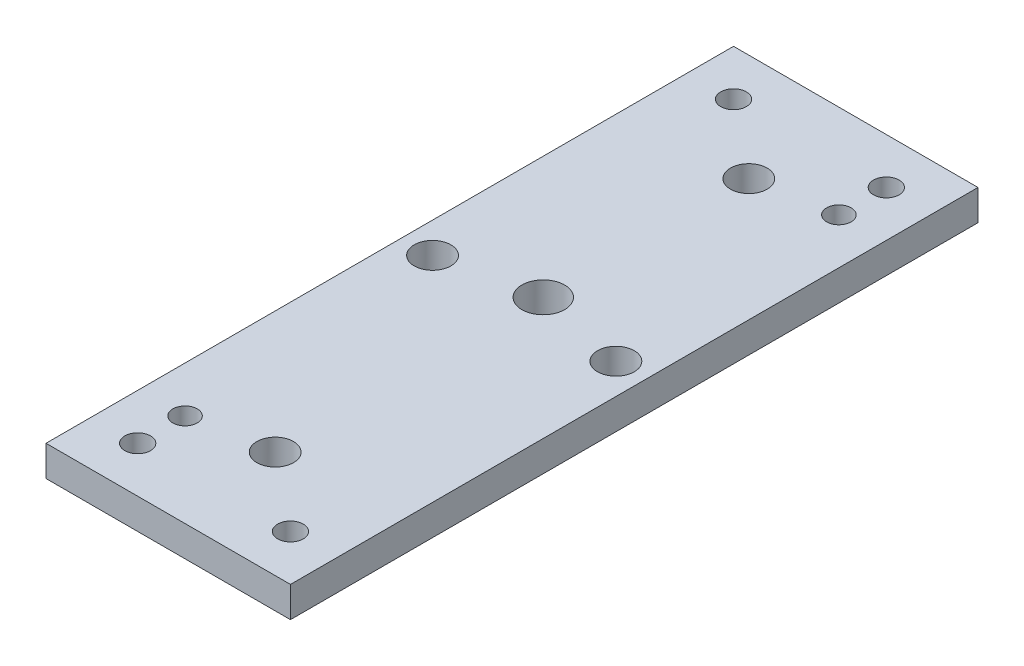
ISO-10303-21;
HEADER;
FILE_DESCRIPTION(('STEP AP214'),'2;1');
FILE_NAME('part.step','',(''),(''),'','','');
FILE_SCHEMA(('AUTOMOTIVE_DESIGN { 1 0 10303 214 1 1 1 1 }'));
ENDSEC;
DATA;
#1=APPLICATION_CONTEXT('core data for automotive mechanical design processes');
#2=APPLICATION_PROTOCOL_DEFINITION('international standard','automotive_design',2000,#1);
#3=PRODUCT_CONTEXT('',#1,'mechanical');
#4=PRODUCT('Part','Part','',(#3));
#5=PRODUCT_RELATED_PRODUCT_CATEGORY('part','',(#4));
#6=PRODUCT_DEFINITION_FORMATION('','',#4);
#7=PRODUCT_DEFINITION_CONTEXT('part definition',#1,'design');
#8=PRODUCT_DEFINITION('design','',#6,#7);
#9=PRODUCT_DEFINITION_SHAPE('','',#8);
#10=(LENGTH_UNIT() NAMED_UNIT(*) SI_UNIT(.MILLI.,.METRE.));
#11=(NAMED_UNIT(*) PLANE_ANGLE_UNIT() SI_UNIT($,.RADIAN.));
#12=(NAMED_UNIT(*) SI_UNIT($,.STERADIAN.) SOLID_ANGLE_UNIT());
#13=UNCERTAINTY_MEASURE_WITH_UNIT(LENGTH_MEASURE(1.E-05),#10,'distance_accuracy_value','');
#14=(GEOMETRIC_REPRESENTATION_CONTEXT(3) GLOBAL_UNCERTAINTY_ASSIGNED_CONTEXT((#13)) GLOBAL_UNIT_ASSIGNED_CONTEXT((#10,
#11,#12)) REPRESENTATION_CONTEXT('',''));
#15=CARTESIAN_POINT('',(0.,0.,0.));
#16=DIRECTION('',(0.,0.,1.));
#17=DIRECTION('',(1.,0.,0.));
#18=AXIS2_PLACEMENT_3D('',#15,#16,#17);
#19=CARTESIAN_POINT('',(40.,-10.,112.5));
#20=DIRECTION('',(1.,0.,0.));
#21=DIRECTION('',(0.,0.,-1.));
#22=AXIS2_PLACEMENT_3D('',#19,#20,#21);
#23=PLANE('',#22);
#24=DIRECTION('',(0.,0.,-1.));
#25=VECTOR('',#24,1.);
#26=CARTESIAN_POINT('',(40.,0.,112.5));
#27=LINE('',#26,#25);
#28=CARTESIAN_POINT('',(40.,0.,112.5));
#29=VERTEX_POINT('',#28);
#30=CARTESIAN_POINT('',(40.,0.,-112.5));
#31=VERTEX_POINT('',#30);
#32=EDGE_CURVE('E106',#29,#31,#27,.T.);
#33=ORIENTED_EDGE('',*,*,#32,.F.);
#34=DIRECTION('',(0.,1.,0.));
#35=VECTOR('',#34,1.);
#36=CARTESIAN_POINT('',(40.,-10.,112.5));
#37=LINE('',#36,#35);
#38=CARTESIAN_POINT('',(40.,-10.,112.5));
#39=VERTEX_POINT('',#38);
#40=EDGE_CURVE('E11',#39,#29,#37,.T.);
#41=ORIENTED_EDGE('',*,*,#40,.F.);
#42=DIRECTION('',(0.,0.,-1.));
#43=VECTOR('',#42,1.);
#44=CARTESIAN_POINT('',(40.,-10.,112.5));
#45=LINE('',#44,#43);
#46=CARTESIAN_POINT('',(40.,-10.,-112.5));
#47=VERTEX_POINT('',#46);
#48=EDGE_CURVE('E99',#39,#47,#45,.T.);
#49=ORIENTED_EDGE('',*,*,#48,.T.);
#50=DIRECTION('',(0.,1.,0.));
#51=VECTOR('',#50,1.);
#52=CARTESIAN_POINT('',(40.,-10.,-112.5));
#53=LINE('',#52,#51);
#54=EDGE_CURVE('E44',#47,#31,#53,.T.);
#55=ORIENTED_EDGE('',*,*,#54,.T.);
#56=EDGE_LOOP('',(#33,#41,#49,#55));
#57=FACE_BOUND('',#56,.T.);
#58=ADVANCED_FACE('F41',(#57),#23,.T.);
#59=CARTESIAN_POINT('',(-40.,-10.,112.5));
#60=DIRECTION('',(0.,0.,1.));
#61=DIRECTION('',(1.,0.,0.));
#62=AXIS2_PLACEMENT_3D('',#59,#60,#61);
#63=PLANE('',#62);
#64=DIRECTION('',(1.,0.,0.));
#65=VECTOR('',#64,1.);
#66=CARTESIAN_POINT('',(-40.,0.,112.5));
#67=LINE('',#66,#65);
#68=CARTESIAN_POINT('',(-40.,0.,112.5));
#69=VERTEX_POINT('',#68);
#70=EDGE_CURVE('E101',#69,#29,#67,.T.);
#71=ORIENTED_EDGE('',*,*,#70,.F.);
#72=DIRECTION('',(0.,1.,0.));
#73=VECTOR('',#72,1.);
#74=CARTESIAN_POINT('',(-40.,-10.,112.5));
#75=LINE('',#74,#73);
#76=CARTESIAN_POINT('',(-40.,-10.,112.5));
#77=VERTEX_POINT('',#76);
#78=EDGE_CURVE('E50',#77,#69,#75,.T.);
#79=ORIENTED_EDGE('',*,*,#78,.F.);
#80=DIRECTION('',(1.,0.,0.));
#81=VECTOR('',#80,1.);
#82=CARTESIAN_POINT('',(-40.,-10.,112.5));
#83=LINE('',#82,#81);
#84=EDGE_CURVE('E96',#77,#39,#83,.T.);
#85=ORIENTED_EDGE('',*,*,#84,.T.);
#86=ORIENTED_EDGE('',*,*,#40,.T.);
#87=EDGE_LOOP('',(#71,#79,#85,#86));
#88=FACE_BOUND('',#87,.T.);
#89=ADVANCED_FACE('F117',(#88),#63,.T.);
#90=CARTESIAN_POINT('',(-40.,-10.,112.5));
#91=DIRECTION('',(-1.,0.,0.));
#92=DIRECTION('',(0.,0.,1.));
#93=AXIS2_PLACEMENT_3D('',#90,#91,#92);
#94=PLANE('',#93);
#95=DIRECTION('',(0.,0.,1.));
#96=VECTOR('',#95,1.);
#97=CARTESIAN_POINT('',(-40.,0.,112.5));
#98=LINE('',#97,#96);
#99=CARTESIAN_POINT('',(-40.,0.,-112.5));
#100=VERTEX_POINT('',#99);
#101=EDGE_CURVE('E91',#100,#69,#98,.T.);
#102=ORIENTED_EDGE('',*,*,#101,.F.);
#103=DIRECTION('',(0.,1.,0.));
#104=VECTOR('',#103,1.);
#105=CARTESIAN_POINT('',(-40.,-10.,-112.5));
#106=LINE('',#105,#104);
#107=CARTESIAN_POINT('',(-40.,-10.,-112.5));
#108=VERTEX_POINT('',#107);
#109=EDGE_CURVE('E86',#108,#100,#106,.T.);
#110=ORIENTED_EDGE('',*,*,#109,.F.);
#111=DIRECTION('',(0.,0.,1.));
#112=VECTOR('',#111,1.);
#113=CARTESIAN_POINT('',(-40.,-10.,112.5));
#114=LINE('',#113,#112);
#115=EDGE_CURVE('E89',#108,#77,#114,.T.);
#116=ORIENTED_EDGE('',*,*,#115,.T.);
#117=ORIENTED_EDGE('',*,*,#78,.T.);
#118=EDGE_LOOP('',(#102,#110,#116,#117));
#119=FACE_BOUND('',#118,.T.);
#120=ADVANCED_FACE('F88',(#119),#94,.T.);
#121=CARTESIAN_POINT('',(-40.,-10.,-112.5));
#122=DIRECTION('',(0.,0.,-1.));
#123=DIRECTION('',(-1.,0.,0.));
#124=AXIS2_PLACEMENT_3D('',#121,#122,#123);
#125=PLANE('',#124);
#126=DIRECTION('',(-1.,0.,0.));
#127=VECTOR('',#126,1.);
#128=CARTESIAN_POINT('',(-40.,0.,-112.5));
#129=LINE('',#128,#127);
#130=EDGE_CURVE('E109',#31,#100,#129,.T.);
#131=ORIENTED_EDGE('',*,*,#130,.F.);
#132=ORIENTED_EDGE('',*,*,#54,.F.);
#133=DIRECTION('',(-1.,0.,0.));
#134=VECTOR('',#133,1.);
#135=CARTESIAN_POINT('',(-40.,-10.,-112.5));
#136=LINE('',#135,#134);
#137=EDGE_CURVE('E95',#47,#108,#136,.T.);
#138=ORIENTED_EDGE('',*,*,#137,.T.);
#139=ORIENTED_EDGE('',*,*,#109,.T.);
#140=EDGE_LOOP('',(#131,#132,#138,#139));
#141=FACE_BOUND('',#140,.T.);
#142=ADVANCED_FACE('F98',(#141),#125,.T.);
#143=CARTESIAN_POINT('',(0.,-10.,0.));
#144=DIRECTION('',(0.,-1.,0.));
#145=DIRECTION('',(0.,0.,-1.));
#146=AXIS2_PLACEMENT_3D('',#143,#144,#145);
#147=PLANE('',#146);
#148=CARTESIAN_POINT('',(-2.22044604925031E-13,-10.,-10.2299999999956));
#149=DIRECTION('',(0.,-1.,0.));
#150=DIRECTION('',(0.,0.,-1.));
#151=AXIS2_PLACEMENT_3D('',#148,#149,#150);
#152=CIRCLE('',#151,7.);
#153=CARTESIAN_POINT('',(-2.22044604925031E-13,-10.,-17.2299999999956));
#154=VERTEX_POINT('',#153);
#155=EDGE_CURVE('E186',#154,#154,#152,.F.);
#156=ORIENTED_EDGE('',*,*,#155,.T.);
#157=EDGE_LOOP('',(#156));
#158=FACE_BOUND('',#157,.T.);
#159=CARTESIAN_POINT('',(24.9999999999999,-10.,-81.975));
#160=DIRECTION('',(0.,1.,0.));
#161=DIRECTION('',(0.,0.,1.));
#162=AXIS2_PLACEMENT_3D('',#159,#160,#161);
#163=CIRCLE('',#162,4.);
#164=CARTESIAN_POINT('',(24.9999999999999,-10.,-77.975));
#165=VERTEX_POINT('',#164);
#166=EDGE_CURVE('E193',#165,#165,#163,.T.);
#167=ORIENTED_EDGE('',*,*,#166,.T.);
#168=EDGE_LOOP('',(#167));
#169=FACE_BOUND('',#168,.T.);
#170=CARTESIAN_POINT('',(-25.0000000000001,-10.,82.));
#171=DIRECTION('',(0.,1.,0.));
#172=DIRECTION('',(0.,0.,1.));
#173=AXIS2_PLACEMENT_3D('',#170,#171,#172);
#174=CIRCLE('',#173,4.);
#175=CARTESIAN_POINT('',(-25.0000000000001,-10.,86.));
#176=VERTEX_POINT('',#175);
#177=EDGE_CURVE('E202',#176,#176,#174,.T.);
#178=ORIENTED_EDGE('',*,*,#177,.T.);
#179=EDGE_LOOP('',(#178));
#180=FACE_BOUND('',#179,.T.);
#181=CARTESIAN_POINT('',(-25.0000000000001,-10.,-97.5));
#182=DIRECTION('',(0.,1.,0.));
#183=DIRECTION('',(0.,0.,1.));
#184=AXIS2_PLACEMENT_3D('',#181,#182,#183);
#185=CIRCLE('',#184,4.2);
#186=CARTESIAN_POINT('',(-25.0000000000001,-10.,-93.3));
#187=VERTEX_POINT('',#186);
#188=EDGE_CURVE('E208',#187,#187,#185,.T.);
#189=ORIENTED_EDGE('',*,*,#188,.T.);
#190=EDGE_LOOP('',(#189));
#191=FACE_BOUND('',#190,.T.);
#192=CARTESIAN_POINT('',(24.9999999999999,-10.,-97.5));
#193=DIRECTION('',(0.,1.,0.));
#194=DIRECTION('',(0.,0.,1.));
#195=AXIS2_PLACEMENT_3D('',#192,#193,#194);
#196=CIRCLE('',#195,4.2);
#197=CARTESIAN_POINT('',(24.9999999999999,-10.,-93.3));
#198=VERTEX_POINT('',#197);
#199=EDGE_CURVE('E214',#198,#198,#196,.T.);
#200=ORIENTED_EDGE('',*,*,#199,.T.);
#201=EDGE_LOOP('',(#200));
#202=FACE_BOUND('',#201,.T.);
#203=CARTESIAN_POINT('',(24.9999999999999,-10.,97.5));
#204=DIRECTION('',(0.,1.,0.));
#205=DIRECTION('',(0.,0.,1.));
#206=AXIS2_PLACEMENT_3D('',#203,#204,#205);
#207=CIRCLE('',#206,4.2);
#208=CARTESIAN_POINT('',(24.9999999999999,-10.,101.7));
#209=VERTEX_POINT('',#208);
#210=EDGE_CURVE('E220',#209,#209,#207,.T.);
#211=ORIENTED_EDGE('',*,*,#210,.T.);
#212=EDGE_LOOP('',(#211));
#213=FACE_BOUND('',#212,.T.);
#214=CARTESIAN_POINT('',(-25.0000000000001,-10.,97.5));
#215=DIRECTION('',(0.,1.,0.));
#216=DIRECTION('',(0.,0.,1.));
#217=AXIS2_PLACEMENT_3D('',#214,#215,#216);
#218=CIRCLE('',#217,4.2);
#219=CARTESIAN_POINT('',(-25.0000000000001,-10.,101.7));
#220=VERTEX_POINT('',#219);
#221=EDGE_CURVE('E226',#220,#220,#218,.T.);
#222=ORIENTED_EDGE('',*,*,#221,.T.);
#223=EDGE_LOOP('',(#222));
#224=FACE_BOUND('',#223,.T.);
#225=CARTESIAN_POINT('',(0.,-10.,-77.5));
#226=DIRECTION('',(0.,-1.,0.));
#227=DIRECTION('',(0.,0.,-1.));
#228=AXIS2_PLACEMENT_3D('',#225,#226,#227);
#229=CIRCLE('',#228,6.00000000000001);
#230=CARTESIAN_POINT('',(0.,-10.,-83.5));
#231=VERTEX_POINT('',#230);
#232=EDGE_CURVE('E232',#231,#231,#229,.F.);
#233=ORIENTED_EDGE('',*,*,#232,.T.);
#234=EDGE_LOOP('',(#233));
#235=FACE_BOUND('',#234,.T.);
#236=CARTESIAN_POINT('',(29.9999999999999,-10.,-4.00000000000001));
#237=DIRECTION('',(0.,-1.,0.));
#238=DIRECTION('',(0.,0.,-1.));
#239=AXIS2_PLACEMENT_3D('',#236,#237,#238);
#240=CIRCLE('',#239,6.);
#241=CARTESIAN_POINT('',(29.9999999999999,-10.,-10.));
#242=VERTEX_POINT('',#241);
#243=EDGE_CURVE('E235',#242,#242,#240,.F.);
#244=ORIENTED_EDGE('',*,*,#243,.T.);
#245=EDGE_LOOP('',(#244));
#246=FACE_BOUND('',#245,.T.);
#247=CARTESIAN_POINT('',(-30.0000000000001,-10.,-4.00000000000001));
#248=DIRECTION('',(0.,-1.,0.));
#249=DIRECTION('',(0.,0.,-1.));
#250=AXIS2_PLACEMENT_3D('',#247,#248,#249);
#251=CIRCLE('',#250,6.);
#252=CARTESIAN_POINT('',(-30.0000000000001,-10.,-10.));
#253=VERTEX_POINT('',#252);
#254=EDGE_CURVE('E241',#253,#253,#251,.F.);
#255=ORIENTED_EDGE('',*,*,#254,.T.);
#256=EDGE_LOOP('',(#255));
#257=FACE_BOUND('',#256,.T.);
#258=CARTESIAN_POINT('',(0.,-10.,77.5));
#259=DIRECTION('',(0.,-1.,0.));
#260=DIRECTION('',(0.,0.,-1.));
#261=AXIS2_PLACEMENT_3D('',#258,#259,#260);
#262=CIRCLE('',#261,6.00000000000001);
#263=CARTESIAN_POINT('',(0.,-10.,71.5));
#264=VERTEX_POINT('',#263);
#265=EDGE_CURVE('E247',#264,#264,#262,.F.);
#266=ORIENTED_EDGE('',*,*,#265,.T.);
#267=EDGE_LOOP('',(#266));
#268=FACE_BOUND('',#267,.T.);
#269=ORIENTED_EDGE('',*,*,#48,.F.);
#270=ORIENTED_EDGE('',*,*,#84,.F.);
#271=ORIENTED_EDGE('',*,*,#115,.F.);
#272=ORIENTED_EDGE('',*,*,#137,.F.);
#273=EDGE_LOOP('',(#269,#270,#271,#272));
#274=FACE_BOUND('',#273,.T.);
#275=ADVANCED_FACE('F94',(#158,#169,#180,#191,#202,#213,#224,#235,#246,#257,#268,#274),#147,.T.);
#276=CARTESIAN_POINT('',(0.,0.,0.));
#277=DIRECTION('',(0.,-1.,0.));
#278=DIRECTION('',(0.,0.,-1.));
#279=AXIS2_PLACEMENT_3D('',#276,#277,#278);
#280=PLANE('',#279);
#281=CARTESIAN_POINT('',(-2.22044604925031E-13,0.,-10.2299999999956));
#282=DIRECTION('',(0.,1.,0.));
#283=DIRECTION('',(0.,0.,1.));
#284=AXIS2_PLACEMENT_3D('',#281,#282,#283);
#285=CIRCLE('',#284,7.);
#286=CARTESIAN_POINT('',(-2.22044604925031E-13,0.,-3.22999999999561));
#287=VERTEX_POINT('',#286);
#288=EDGE_CURVE('E189',#287,#287,#285,.T.);
#289=ORIENTED_EDGE('',*,*,#288,.F.);
#290=EDGE_LOOP('',(#289));
#291=FACE_BOUND('',#290,.T.);
#292=CARTESIAN_POINT('',(24.9999999999999,0.,-81.975));
#293=DIRECTION('',(0.,1.,0.));
#294=DIRECTION('',(0.,0.,1.));
#295=AXIS2_PLACEMENT_3D('',#292,#293,#294);
#296=CIRCLE('',#295,4.);
#297=CARTESIAN_POINT('',(24.9999999999999,0.,-77.975));
#298=VERTEX_POINT('',#297);
#299=EDGE_CURVE('E190',#298,#298,#296,.T.);
#300=ORIENTED_EDGE('',*,*,#299,.F.);
#301=EDGE_LOOP('',(#300));
#302=FACE_BOUND('',#301,.T.);
#303=CARTESIAN_POINT('',(-25.0000000000001,0.,82.));
#304=DIRECTION('',(0.,1.,0.));
#305=DIRECTION('',(0.,0.,1.));
#306=AXIS2_PLACEMENT_3D('',#303,#304,#305);
#307=CIRCLE('',#306,4.);
#308=CARTESIAN_POINT('',(-25.0000000000001,0.,86.));
#309=VERTEX_POINT('',#308);
#310=EDGE_CURVE('E199',#309,#309,#307,.T.);
#311=ORIENTED_EDGE('',*,*,#310,.F.);
#312=EDGE_LOOP('',(#311));
#313=FACE_BOUND('',#312,.T.);
#314=CARTESIAN_POINT('',(-25.0000000000001,0.,-97.5));
#315=DIRECTION('',(0.,1.,0.));
#316=DIRECTION('',(0.,0.,1.));
#317=AXIS2_PLACEMENT_3D('',#314,#315,#316);
#318=CIRCLE('',#317,4.2);
#319=CARTESIAN_POINT('',(-25.0000000000001,0.,-93.3));
#320=VERTEX_POINT('',#319);
#321=EDGE_CURVE('E205',#320,#320,#318,.T.);
#322=ORIENTED_EDGE('',*,*,#321,.F.);
#323=EDGE_LOOP('',(#322));
#324=FACE_BOUND('',#323,.T.);
#325=CARTESIAN_POINT('',(24.9999999999999,0.,-97.5));
#326=DIRECTION('',(0.,1.,0.));
#327=DIRECTION('',(0.,0.,1.));
#328=AXIS2_PLACEMENT_3D('',#325,#326,#327);
#329=CIRCLE('',#328,4.2);
#330=CARTESIAN_POINT('',(24.9999999999999,0.,-93.3));
#331=VERTEX_POINT('',#330);
#332=EDGE_CURVE('E211',#331,#331,#329,.T.);
#333=ORIENTED_EDGE('',*,*,#332,.F.);
#334=EDGE_LOOP('',(#333));
#335=FACE_BOUND('',#334,.T.);
#336=CARTESIAN_POINT('',(24.9999999999999,0.,97.5));
#337=DIRECTION('',(0.,1.,0.));
#338=DIRECTION('',(0.,0.,1.));
#339=AXIS2_PLACEMENT_3D('',#336,#337,#338);
#340=CIRCLE('',#339,4.2);
#341=CARTESIAN_POINT('',(24.9999999999999,0.,101.7));
#342=VERTEX_POINT('',#341);
#343=EDGE_CURVE('E217',#342,#342,#340,.T.);
#344=ORIENTED_EDGE('',*,*,#343,.F.);
#345=EDGE_LOOP('',(#344));
#346=FACE_BOUND('',#345,.T.);
#347=CARTESIAN_POINT('',(-25.0000000000001,0.,97.5));
#348=DIRECTION('',(0.,1.,0.));
#349=DIRECTION('',(0.,0.,1.));
#350=AXIS2_PLACEMENT_3D('',#347,#348,#349);
#351=CIRCLE('',#350,4.2);
#352=CARTESIAN_POINT('',(-25.0000000000001,0.,101.7));
#353=VERTEX_POINT('',#352);
#354=EDGE_CURVE('E223',#353,#353,#351,.T.);
#355=ORIENTED_EDGE('',*,*,#354,.F.);
#356=EDGE_LOOP('',(#355));
#357=FACE_BOUND('',#356,.T.);
#358=CARTESIAN_POINT('',(0.,0.,-77.5));
#359=DIRECTION('',(0.,1.,0.));
#360=DIRECTION('',(0.,0.,1.));
#361=AXIS2_PLACEMENT_3D('',#358,#359,#360);
#362=CIRCLE('',#361,6.00000000000001);
#363=CARTESIAN_POINT('',(0.,0.,-71.5));
#364=VERTEX_POINT('',#363);
#365=EDGE_CURVE('E110',#364,#364,#362,.T.);
#366=ORIENTED_EDGE('',*,*,#365,.F.);
#367=EDGE_LOOP('',(#366));
#368=FACE_BOUND('',#367,.T.);
#369=CARTESIAN_POINT('',(29.9999999999999,0.,-4.00000000000001));
#370=DIRECTION('',(0.,1.,0.));
#371=DIRECTION('',(0.,0.,1.));
#372=AXIS2_PLACEMENT_3D('',#369,#370,#371);
#373=CIRCLE('',#372,6.);
#374=CARTESIAN_POINT('',(29.9999999999999,0.,1.99999999999999));
#375=VERTEX_POINT('',#374);
#376=EDGE_CURVE('E238',#375,#375,#373,.T.);
#377=ORIENTED_EDGE('',*,*,#376,.F.);
#378=EDGE_LOOP('',(#377));
#379=FACE_BOUND('',#378,.T.);
#380=CARTESIAN_POINT('',(-30.0000000000001,0.,-4.00000000000001));
#381=DIRECTION('',(0.,1.,0.));
#382=DIRECTION('',(0.,0.,1.));
#383=AXIS2_PLACEMENT_3D('',#380,#381,#382);
#384=CIRCLE('',#383,6.);
#385=CARTESIAN_POINT('',(-30.0000000000001,0.,1.99999999999998));
#386=VERTEX_POINT('',#385);
#387=EDGE_CURVE('E244',#386,#386,#384,.T.);
#388=ORIENTED_EDGE('',*,*,#387,.F.);
#389=EDGE_LOOP('',(#388));
#390=FACE_BOUND('',#389,.T.);
#391=CARTESIAN_POINT('',(0.,0.,77.5));
#392=DIRECTION('',(0.,1.,0.));
#393=DIRECTION('',(0.,0.,1.));
#394=AXIS2_PLACEMENT_3D('',#391,#392,#393);
#395=CIRCLE('',#394,6.00000000000001);
#396=CARTESIAN_POINT('',(0.,0.,83.5));
#397=VERTEX_POINT('',#396);
#398=EDGE_CURVE('E229',#397,#397,#395,.T.);
#399=ORIENTED_EDGE('',*,*,#398,.F.);
#400=EDGE_LOOP('',(#399));
#401=FACE_BOUND('',#400,.T.);
#402=ORIENTED_EDGE('',*,*,#32,.T.);
#403=ORIENTED_EDGE('',*,*,#130,.T.);
#404=ORIENTED_EDGE('',*,*,#101,.T.);
#405=ORIENTED_EDGE('',*,*,#70,.T.);
#406=EDGE_LOOP('',(#402,#403,#404,#405));
#407=FACE_BOUND('',#406,.T.);
#408=ADVANCED_FACE('F116',(#291,#302,#313,#324,#335,#346,#357,#368,#379,#390,#401,#407),#280,.F.);
#409=CARTESIAN_POINT('',(0.,-10.001,77.5));
#410=DIRECTION('',(0.,1.,0.));
#411=DIRECTION('',(0.,0.,1.));
#412=AXIS2_PLACEMENT_3D('',#409,#410,#411);
#413=CYLINDRICAL_SURFACE('',#412,6.00000000000001);
#414=ORIENTED_EDGE('',*,*,#265,.F.);
#415=EDGE_LOOP('',(#414));
#416=FACE_BOUND('',#415,.T.);
#417=ORIENTED_EDGE('',*,*,#398,.T.);
#418=EDGE_LOOP('',(#417));
#419=FACE_BOUND('',#418,.T.);
#420=ADVANCED_FACE('F137',(#416,#419),#413,.F.);
#421=CARTESIAN_POINT('',(-30.0000000000001,-10.001,-4.00000000000001));
#422=DIRECTION('',(0.,1.,0.));
#423=DIRECTION('',(0.,0.,1.));
#424=AXIS2_PLACEMENT_3D('',#421,#422,#423);
#425=CYLINDRICAL_SURFACE('',#424,6.);
#426=ORIENTED_EDGE('',*,*,#254,.F.);
#427=EDGE_LOOP('',(#426));
#428=FACE_BOUND('',#427,.T.);
#429=ORIENTED_EDGE('',*,*,#387,.T.);
#430=EDGE_LOOP('',(#429));
#431=FACE_BOUND('',#430,.T.);
#432=ADVANCED_FACE('F143',(#428,#431),#425,.F.);
#433=CARTESIAN_POINT('',(29.9999999999999,-10.001,-4.00000000000001));
#434=DIRECTION('',(0.,1.,0.));
#435=DIRECTION('',(0.,0.,1.));
#436=AXIS2_PLACEMENT_3D('',#433,#434,#435);
#437=CYLINDRICAL_SURFACE('',#436,6.);
#438=ORIENTED_EDGE('',*,*,#243,.F.);
#439=EDGE_LOOP('',(#438));
#440=FACE_BOUND('',#439,.T.);
#441=ORIENTED_EDGE('',*,*,#376,.T.);
#442=EDGE_LOOP('',(#441));
#443=FACE_BOUND('',#442,.T.);
#444=ADVANCED_FACE('F147',(#440,#443),#437,.F.);
#445=CARTESIAN_POINT('',(0.,-10.001,-77.5));
#446=DIRECTION('',(0.,1.,0.));
#447=DIRECTION('',(0.,0.,1.));
#448=AXIS2_PLACEMENT_3D('',#445,#446,#447);
#449=CYLINDRICAL_SURFACE('',#448,6.00000000000001);
#450=ORIENTED_EDGE('',*,*,#232,.F.);
#451=EDGE_LOOP('',(#450));
#452=FACE_BOUND('',#451,.T.);
#453=ORIENTED_EDGE('',*,*,#365,.T.);
#454=EDGE_LOOP('',(#453));
#455=FACE_BOUND('',#454,.T.);
#456=ADVANCED_FACE('F151',(#452,#455),#449,.F.);
#457=CARTESIAN_POINT('',(-25.0000000000001,0.,97.5));
#458=DIRECTION('',(0.,1.,0.));
#459=DIRECTION('',(0.,0.,1.));
#460=AXIS2_PLACEMENT_3D('',#457,#458,#459);
#461=CYLINDRICAL_SURFACE('',#460,4.2);
#462=ORIENTED_EDGE('',*,*,#221,.F.);
#463=EDGE_LOOP('',(#462));
#464=FACE_BOUND('',#463,.T.);
#465=ORIENTED_EDGE('',*,*,#354,.T.);
#466=EDGE_LOOP('',(#465));
#467=FACE_BOUND('',#466,.T.);
#468=ADVANCED_FACE('F155',(#464,#467),#461,.F.);
#469=CARTESIAN_POINT('',(24.9999999999999,0.,97.5));
#470=DIRECTION('',(0.,1.,0.));
#471=DIRECTION('',(0.,0.,1.));
#472=AXIS2_PLACEMENT_3D('',#469,#470,#471);
#473=CYLINDRICAL_SURFACE('',#472,4.2);
#474=ORIENTED_EDGE('',*,*,#210,.F.);
#475=EDGE_LOOP('',(#474));
#476=FACE_BOUND('',#475,.T.);
#477=ORIENTED_EDGE('',*,*,#343,.T.);
#478=EDGE_LOOP('',(#477));
#479=FACE_BOUND('',#478,.T.);
#480=ADVANCED_FACE('F159',(#476,#479),#473,.F.);
#481=CARTESIAN_POINT('',(24.9999999999999,0.,-97.5));
#482=DIRECTION('',(0.,1.,0.));
#483=DIRECTION('',(0.,0.,1.));
#484=AXIS2_PLACEMENT_3D('',#481,#482,#483);
#485=CYLINDRICAL_SURFACE('',#484,4.2);
#486=ORIENTED_EDGE('',*,*,#199,.F.);
#487=EDGE_LOOP('',(#486));
#488=FACE_BOUND('',#487,.T.);
#489=ORIENTED_EDGE('',*,*,#332,.T.);
#490=EDGE_LOOP('',(#489));
#491=FACE_BOUND('',#490,.T.);
#492=ADVANCED_FACE('F163',(#488,#491),#485,.F.);
#493=CARTESIAN_POINT('',(-25.0000000000001,0.,-97.5));
#494=DIRECTION('',(0.,1.,0.));
#495=DIRECTION('',(0.,0.,1.));
#496=AXIS2_PLACEMENT_3D('',#493,#494,#495);
#497=CYLINDRICAL_SURFACE('',#496,4.2);
#498=ORIENTED_EDGE('',*,*,#188,.F.);
#499=EDGE_LOOP('',(#498));
#500=FACE_BOUND('',#499,.T.);
#501=ORIENTED_EDGE('',*,*,#321,.T.);
#502=EDGE_LOOP('',(#501));
#503=FACE_BOUND('',#502,.T.);
#504=ADVANCED_FACE('F167',(#500,#503),#497,.F.);
#505=CARTESIAN_POINT('',(-25.0000000000001,0.,82.));
#506=DIRECTION('',(0.,1.,0.));
#507=DIRECTION('',(0.,0.,1.));
#508=AXIS2_PLACEMENT_3D('',#505,#506,#507);
#509=CYLINDRICAL_SURFACE('',#508,4.);
#510=ORIENTED_EDGE('',*,*,#177,.F.);
#511=EDGE_LOOP('',(#510));
#512=FACE_BOUND('',#511,.T.);
#513=ORIENTED_EDGE('',*,*,#310,.T.);
#514=EDGE_LOOP('',(#513));
#515=FACE_BOUND('',#514,.T.);
#516=ADVANCED_FACE('F171',(#512,#515),#509,.F.);
#517=CARTESIAN_POINT('',(24.9999999999999,0.,-81.975));
#518=DIRECTION('',(0.,1.,0.));
#519=DIRECTION('',(0.,0.,1.));
#520=AXIS2_PLACEMENT_3D('',#517,#518,#519);
#521=CYLINDRICAL_SURFACE('',#520,4.);
#522=ORIENTED_EDGE('',*,*,#166,.F.);
#523=EDGE_LOOP('',(#522));
#524=FACE_BOUND('',#523,.T.);
#525=ORIENTED_EDGE('',*,*,#299,.T.);
#526=EDGE_LOOP('',(#525));
#527=FACE_BOUND('',#526,.T.);
#528=ADVANCED_FACE('F175',(#524,#527),#521,.F.);
#529=CARTESIAN_POINT('',(-2.22044604925031E-13,-10.001,-10.2299999999956));
#530=DIRECTION('',(0.,1.,0.));
#531=DIRECTION('',(0.,0.,1.));
#532=AXIS2_PLACEMENT_3D('',#529,#530,#531);
#533=CYLINDRICAL_SURFACE('',#532,7.);
#534=ORIENTED_EDGE('',*,*,#155,.F.);
#535=EDGE_LOOP('',(#534));
#536=FACE_BOUND('',#535,.T.);
#537=ORIENTED_EDGE('',*,*,#288,.T.);
#538=EDGE_LOOP('',(#537));
#539=FACE_BOUND('',#538,.T.);
#540=ADVANCED_FACE('F178',(#536,#539),#533,.F.);
#541=CLOSED_SHELL('',(#58,#89,#120,#142,#275,#408,#420,#432,#444,#456,#468,#480,#492,#504,#516,
#528,#540));
#542=MANIFOLD_SOLID_BREP('B2',#541);
#543=ADVANCED_BREP_SHAPE_REPRESENTATION('',(#18,#542),#14);
#544=SHAPE_DEFINITION_REPRESENTATION(#9,#543);
ENDSEC;
END-ISO-10303-21;
